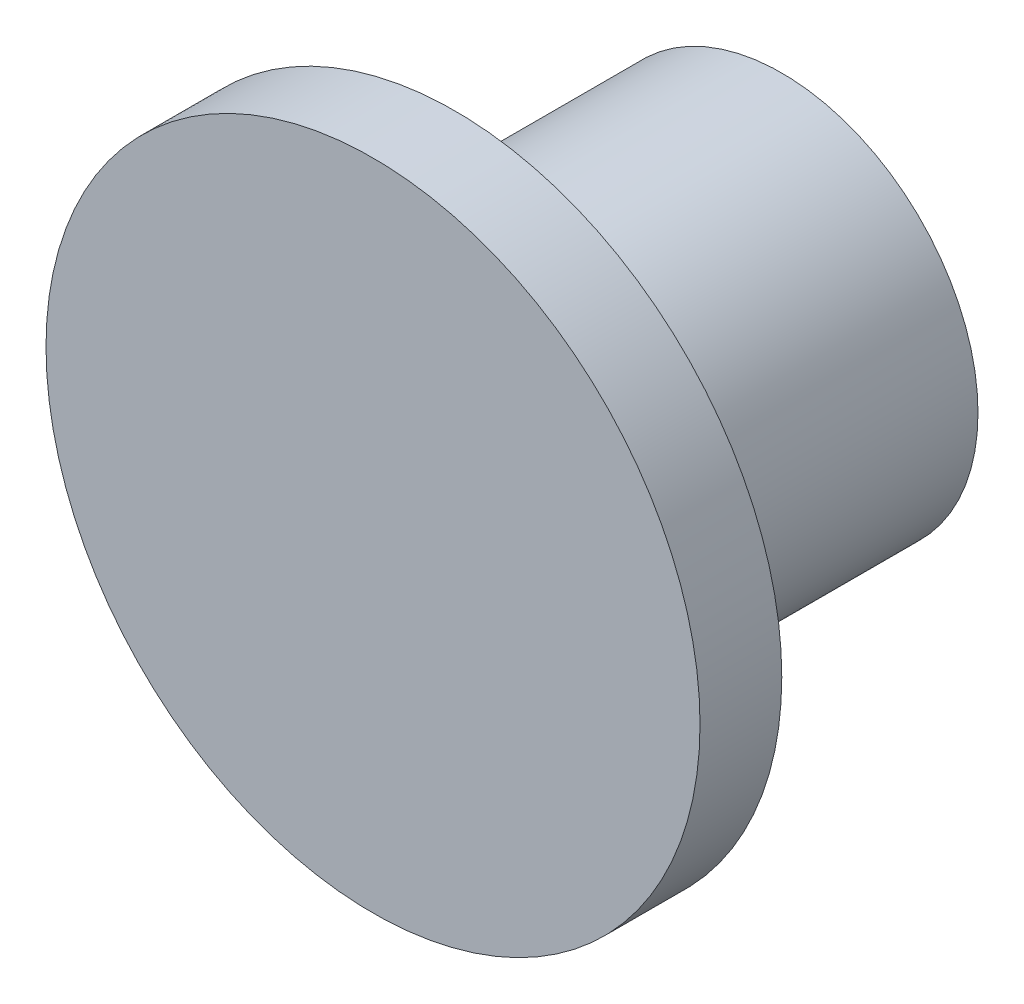
ISO-10303-21;
HEADER;
FILE_DESCRIPTION(('STEP AP214'),'2;1');
FILE_NAME('part.step','',(''),(''),'','','');
FILE_SCHEMA(('AUTOMOTIVE_DESIGN { 1 0 10303 214 1 1 1 1 }'));
ENDSEC;
DATA;
#1=APPLICATION_CONTEXT('core data for automotive mechanical design processes');
#2=APPLICATION_PROTOCOL_DEFINITION('international standard','automotive_design',2000,#1);
#3=PRODUCT_CONTEXT('',#1,'mechanical');
#4=PRODUCT('Part','Part','',(#3));
#5=PRODUCT_RELATED_PRODUCT_CATEGORY('part','',(#4));
#6=PRODUCT_DEFINITION_FORMATION('','',#4);
#7=PRODUCT_DEFINITION_CONTEXT('part definition',#1,'design');
#8=PRODUCT_DEFINITION('design','',#6,#7);
#9=PRODUCT_DEFINITION_SHAPE('','',#8);
#10=(LENGTH_UNIT() NAMED_UNIT(*) SI_UNIT(.MILLI.,.METRE.));
#11=(NAMED_UNIT(*) PLANE_ANGLE_UNIT() SI_UNIT($,.RADIAN.));
#12=(NAMED_UNIT(*) SI_UNIT($,.STERADIAN.) SOLID_ANGLE_UNIT());
#13=UNCERTAINTY_MEASURE_WITH_UNIT(LENGTH_MEASURE(1.E-05),#10,'distance_accuracy_value','');
#14=(GEOMETRIC_REPRESENTATION_CONTEXT(3) GLOBAL_UNCERTAINTY_ASSIGNED_CONTEXT((#13)) GLOBAL_UNIT_ASSIGNED_CONTEXT((#10,
#11,#12)) REPRESENTATION_CONTEXT('',''));
#15=CARTESIAN_POINT('',(0.,0.,0.));
#16=DIRECTION('',(0.,0.,1.));
#17=DIRECTION('',(1.,0.,0.));
#18=AXIS2_PLACEMENT_3D('',#15,#16,#17);
#19=CARTESIAN_POINT('',(0.,0.,5.));
#20=DIRECTION('',(0.,0.,1.));
#21=DIRECTION('',(1.,0.,0.));
#22=AXIS2_PLACEMENT_3D('',#19,#20,#21);
#23=PLANE('',#22);
#24=CARTESIAN_POINT('',(0.,0.,5.));
#25=DIRECTION('',(0.,0.,1.));
#26=DIRECTION('',(1.,0.,0.));
#27=AXIS2_PLACEMENT_3D('',#24,#25,#26);
#28=CIRCLE('',#27,20.);
#29=CARTESIAN_POINT('',(20.,0.,5.));
#30=VERTEX_POINT('',#29);
#31=EDGE_CURVE('E10',#30,#30,#28,.T.);
#32=ORIENTED_EDGE('',*,*,#31,.T.);
#33=EDGE_LOOP('',(#32));
#34=FACE_BOUND('',#33,.T.);
#35=ADVANCED_FACE('F41',(#34),#23,.T.);
#36=CARTESIAN_POINT('',(0.,0.,0.));
#37=DIRECTION('',(0.,0.,1.));
#38=DIRECTION('',(1.,0.,0.));
#39=AXIS2_PLACEMENT_3D('',#36,#37,#38);
#40=PLANE('',#39);
#41=CARTESIAN_POINT('',(0.,0.,0.));
#42=DIRECTION('',(0.,0.,1.));
#43=DIRECTION('',(1.,0.,0.));
#44=AXIS2_PLACEMENT_3D('',#41,#42,#43);
#45=CIRCLE('',#44,20.);
#46=CARTESIAN_POINT('',(20.,0.,0.));
#47=VERTEX_POINT('',#46);
#48=EDGE_CURVE('E45',#47,#47,#45,.T.);
#49=ORIENTED_EDGE('',*,*,#48,.F.);
#50=EDGE_LOOP('',(#49));
#51=FACE_BOUND('',#50,.T.);
#52=CARTESIAN_POINT('',(0.,0.,0.));
#53=DIRECTION('',(0.,0.,1.));
#54=DIRECTION('',(1.,0.,0.));
#55=AXIS2_PLACEMENT_3D('',#52,#53,#54);
#56=CIRCLE('',#55,12.);
#57=CARTESIAN_POINT('',(12.,0.,0.));
#58=VERTEX_POINT('',#57);
#59=EDGE_CURVE('E54',#58,#58,#56,.T.);
#60=ORIENTED_EDGE('',*,*,#59,.T.);
#61=EDGE_LOOP('',(#60));
#62=FACE_BOUND('',#61,.T.);
#63=ADVANCED_FACE('F75',(#51,#62),#40,.F.);
#64=CARTESIAN_POINT('',(0.,0.,5.));
#65=DIRECTION('',(0.,0.,-1.));
#66=DIRECTION('',(-1.,0.,0.));
#67=AXIS2_PLACEMENT_3D('',#64,#65,#66);
#68=CYLINDRICAL_SURFACE('',#67,20.);
#69=ORIENTED_EDGE('',*,*,#31,.F.);
#70=EDGE_LOOP('',(#69));
#71=FACE_BOUND('',#70,.T.);
#72=ORIENTED_EDGE('',*,*,#48,.T.);
#73=EDGE_LOOP('',(#72));
#74=FACE_BOUND('',#73,.T.);
#75=ADVANCED_FACE('F43',(#71,#74),#68,.T.);
#76=CARTESIAN_POINT('',(0.,0.,-20.));
#77=DIRECTION('',(0.,0.,1.));
#78=DIRECTION('',(1.,0.,0.));
#79=AXIS2_PLACEMENT_3D('',#76,#77,#78);
#80=CYLINDRICAL_SURFACE('',#79,12.);
#81=CARTESIAN_POINT('',(0.,0.,-20.));
#82=DIRECTION('',(0.,0.,1.));
#83=DIRECTION('',(1.,0.,0.));
#84=AXIS2_PLACEMENT_3D('',#81,#82,#83);
#85=CIRCLE('',#84,12.);
#86=CARTESIAN_POINT('',(12.,0.,-20.));
#87=VERTEX_POINT('',#86);
#88=EDGE_CURVE('E59',#87,#87,#85,.T.);
#89=ORIENTED_EDGE('',*,*,#88,.T.);
#90=EDGE_LOOP('',(#89));
#91=FACE_BOUND('',#90,.T.);
#92=ORIENTED_EDGE('',*,*,#59,.F.);
#93=EDGE_LOOP('',(#92));
#94=FACE_BOUND('',#93,.T.);
#95=ADVANCED_FACE('F64',(#91,#94),#80,.T.);
#96=CARTESIAN_POINT('',(0.,0.,-20.));
#97=DIRECTION('',(0.,0.,1.));
#98=DIRECTION('',(1.,0.,0.));
#99=AXIS2_PLACEMENT_3D('',#96,#97,#98);
#100=PLANE('',#99);
#101=ORIENTED_EDGE('',*,*,#88,.F.);
#102=EDGE_LOOP('',(#101));
#103=FACE_BOUND('',#102,.T.);
#104=ADVANCED_FACE('F67',(#103),#100,.F.);
#105=CLOSED_SHELL('',(#35,#63,#75,#95,#104));
#106=MANIFOLD_SOLID_BREP('B2',#105);
#107=ADVANCED_BREP_SHAPE_REPRESENTATION('',(#18,#106),#14);
#108=SHAPE_DEFINITION_REPRESENTATION(#9,#107);
ENDSEC;
END-ISO-10303-21;
